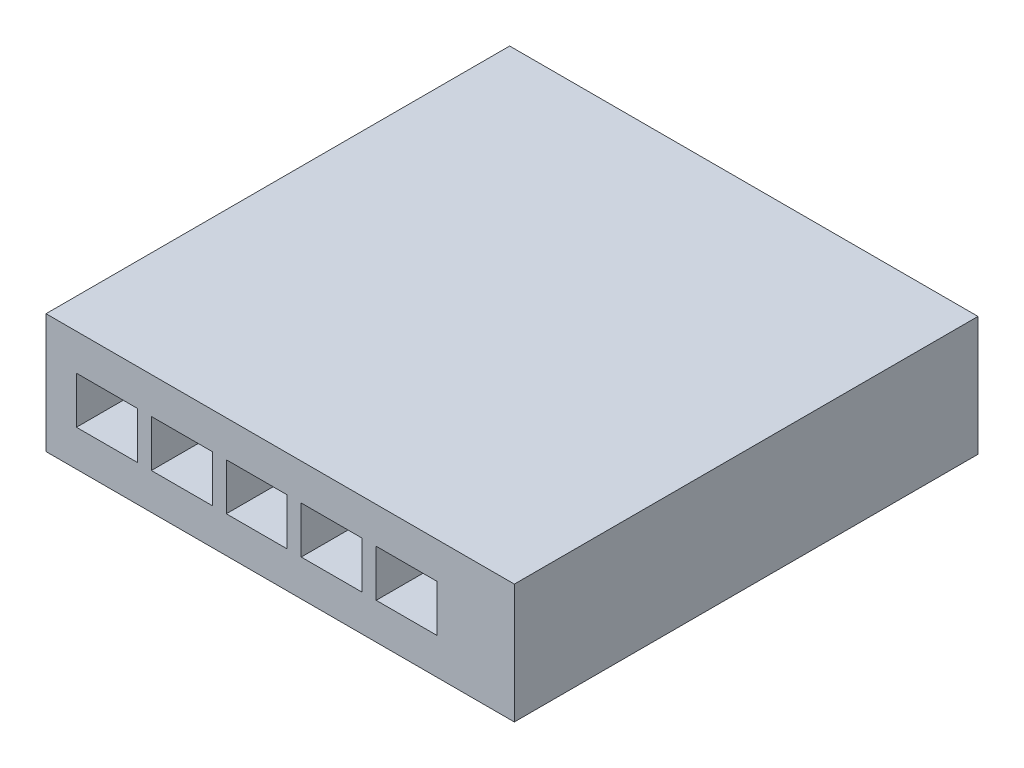
ISO-10303-21;
HEADER;
FILE_DESCRIPTION(('STEP AP214'),'2;1');
FILE_NAME('part.step','',(''),(''),'','','');
FILE_SCHEMA(('AUTOMOTIVE_DESIGN { 1 0 10303 214 1 1 1 1 }'));
ENDSEC;
DATA;
#1=APPLICATION_CONTEXT('core data for automotive mechanical design processes');
#2=APPLICATION_PROTOCOL_DEFINITION('international standard','automotive_design',2000,#1);
#3=PRODUCT_CONTEXT('',#1,'mechanical');
#4=PRODUCT('Part','Part','',(#3));
#5=PRODUCT_RELATED_PRODUCT_CATEGORY('part','',(#4));
#6=PRODUCT_DEFINITION_FORMATION('','',#4);
#7=PRODUCT_DEFINITION_CONTEXT('part definition',#1,'design');
#8=PRODUCT_DEFINITION('design','',#6,#7);
#9=PRODUCT_DEFINITION_SHAPE('','',#8);
#10=(LENGTH_UNIT() NAMED_UNIT(*) SI_UNIT(.MILLI.,.METRE.));
#11=(NAMED_UNIT(*) PLANE_ANGLE_UNIT() SI_UNIT($,.RADIAN.));
#12=(NAMED_UNIT(*) SI_UNIT($,.STERADIAN.) SOLID_ANGLE_UNIT());
#13=UNCERTAINTY_MEASURE_WITH_UNIT(LENGTH_MEASURE(1.E-05),#10,'distance_accuracy_value','');
#14=(GEOMETRIC_REPRESENTATION_CONTEXT(3) GLOBAL_UNCERTAINTY_ASSIGNED_CONTEXT((#13)) GLOBAL_UNIT_ASSIGNED_CONTEXT((#10,
#11,#12)) REPRESENTATION_CONTEXT('',''));
#15=CARTESIAN_POINT('',(0.,0.,0.));
#16=DIRECTION('',(0.,0.,1.));
#17=DIRECTION('',(1.,0.,0.));
#18=AXIS2_PLACEMENT_3D('',#15,#16,#17);
#19=CARTESIAN_POINT('',(64.,0.,29.5));
#20=DIRECTION('',(0.,0.,1.));
#21=DIRECTION('',(1.,0.,0.));
#22=AXIS2_PLACEMENT_3D('',#19,#20,#21);
#23=PLANE('',#22);
#24=DIRECTION('',(0.,1.,0.));
#25=VECTOR('',#24,1.);
#26=CARTESIAN_POINT('',(33.5,5.,29.5));
#27=LINE('',#26,#25);
#28=CARTESIAN_POINT('',(33.5,-5.,29.5));
#29=VERTEX_POINT('',#28);
#30=CARTESIAN_POINT('',(33.5,5.,29.5));
#31=VERTEX_POINT('',#30);
#32=EDGE_CURVE('E449',#29,#31,#27,.T.);
#33=ORIENTED_EDGE('',*,*,#32,.T.);
#34=DIRECTION('',(-1.,0.,0.));
#35=VECTOR('',#34,1.);
#36=CARTESIAN_POINT('',(20.5,5.,29.5));
#37=LINE('',#36,#35);
#38=CARTESIAN_POINT('',(20.5,5.,29.5));
#39=VERTEX_POINT('',#38);
#40=EDGE_CURVE('E11',#31,#39,#37,.T.);
#41=ORIENTED_EDGE('',*,*,#40,.T.);
#42=DIRECTION('',(0.,-1.,0.));
#43=VECTOR('',#42,1.);
#44=CARTESIAN_POINT('',(20.5,5.,29.5));
#45=LINE('',#44,#43);
#46=CARTESIAN_POINT('',(20.5,-5.,29.5));
#47=VERTEX_POINT('',#46);
#48=EDGE_CURVE('E53',#39,#47,#45,.T.);
#49=ORIENTED_EDGE('',*,*,#48,.T.);
#50=DIRECTION('',(1.,0.,0.));
#51=VECTOR('',#50,1.);
#52=CARTESIAN_POINT('',(20.5,-5.,29.5));
#53=LINE('',#52,#51);
#54=EDGE_CURVE('E61',#47,#29,#53,.T.);
#55=ORIENTED_EDGE('',*,*,#54,.T.);
#56=EDGE_LOOP('',(#33,#41,#49,#55));
#57=FACE_BOUND('',#56,.T.);
#58=ADVANCED_FACE('F38',(#57),#23,.T.);
#59=CARTESIAN_POINT('',(20.5,5.,29.5));
#60=DIRECTION('',(0.,1.,0.));
#61=DIRECTION('',(0.,0.,1.));
#62=AXIS2_PLACEMENT_3D('',#59,#60,#61);
#63=PLANE('',#62);
#64=DIRECTION('',(-1.,0.,0.));
#65=VECTOR('',#64,1.);
#66=CARTESIAN_POINT('',(20.5,5.,49.5));
#67=LINE('',#66,#65);
#68=CARTESIAN_POINT('',(33.5,5.,49.5));
#69=VERTEX_POINT('',#68);
#70=CARTESIAN_POINT('',(20.5,5.,49.5));
#71=VERTEX_POINT('',#70);
#72=EDGE_CURVE('E441',#69,#71,#67,.T.);
#73=ORIENTED_EDGE('',*,*,#72,.T.);
#74=DIRECTION('',(0.,0.,1.));
#75=VECTOR('',#74,1.);
#76=CARTESIAN_POINT('',(20.5,5.,29.5));
#77=LINE('',#76,#75);
#78=EDGE_CURVE('E46',#39,#71,#77,.T.);
#79=ORIENTED_EDGE('',*,*,#78,.F.);
#80=ORIENTED_EDGE('',*,*,#40,.F.);
#81=DIRECTION('',(0.,0.,1.));
#82=VECTOR('',#81,1.);
#83=CARTESIAN_POINT('',(33.5,5.,29.5));
#84=LINE('',#83,#82);
#85=EDGE_CURVE('E445',#31,#69,#84,.T.);
#86=ORIENTED_EDGE('',*,*,#85,.T.);
#87=EDGE_LOOP('',(#73,#79,#80,#86));
#88=FACE_BOUND('',#87,.T.);
#89=ADVANCED_FACE('F467',(#88),#63,.F.);
#90=CARTESIAN_POINT('',(20.5,5.,29.5));
#91=DIRECTION('',(-1.,0.,0.));
#92=DIRECTION('',(0.,0.,1.));
#93=AXIS2_PLACEMENT_3D('',#90,#91,#92);
#94=PLANE('',#93);
#95=DIRECTION('',(0.,-1.,0.));
#96=VECTOR('',#95,1.);
#97=CARTESIAN_POINT('',(20.5,5.,49.5));
#98=LINE('',#97,#96);
#99=CARTESIAN_POINT('',(20.5,-5.,49.5));
#100=VERTEX_POINT('',#99);
#101=EDGE_CURVE('E437',#71,#100,#98,.T.);
#102=ORIENTED_EDGE('',*,*,#101,.T.);
#103=DIRECTION('',(0.,0.,1.));
#104=VECTOR('',#103,1.);
#105=CARTESIAN_POINT('',(20.5,-5.,29.5));
#106=LINE('',#105,#104);
#107=EDGE_CURVE('E459',#47,#100,#106,.T.);
#108=ORIENTED_EDGE('',*,*,#107,.F.);
#109=ORIENTED_EDGE('',*,*,#48,.F.);
#110=ORIENTED_EDGE('',*,*,#78,.T.);
#111=EDGE_LOOP('',(#102,#108,#109,#110));
#112=FACE_BOUND('',#111,.T.);
#113=ADVANCED_FACE('F464',(#112),#94,.F.);
#114=CARTESIAN_POINT('',(20.5,-5.,29.5));
#115=DIRECTION('',(0.,-1.,0.));
#116=DIRECTION('',(0.,0.,-1.));
#117=AXIS2_PLACEMENT_3D('',#114,#115,#116);
#118=PLANE('',#117);
#119=DIRECTION('',(1.,0.,0.));
#120=VECTOR('',#119,1.);
#121=CARTESIAN_POINT('',(20.5,-5.,49.5));
#122=LINE('',#121,#120);
#123=CARTESIAN_POINT('',(33.5,-5.,49.5));
#124=VERTEX_POINT('',#123);
#125=EDGE_CURVE('E433',#100,#124,#122,.T.);
#126=ORIENTED_EDGE('',*,*,#125,.T.);
#127=DIRECTION('',(0.,0.,1.));
#128=VECTOR('',#127,1.);
#129=CARTESIAN_POINT('',(33.5,-5.,29.5));
#130=LINE('',#129,#128);
#131=EDGE_CURVE('E453',#29,#124,#130,.T.);
#132=ORIENTED_EDGE('',*,*,#131,.F.);
#133=ORIENTED_EDGE('',*,*,#54,.F.);
#134=ORIENTED_EDGE('',*,*,#107,.T.);
#135=EDGE_LOOP('',(#126,#132,#133,#134));
#136=FACE_BOUND('',#135,.T.);
#137=ADVANCED_FACE('F472',(#136),#118,.F.);
#138=CARTESIAN_POINT('',(33.5,5.,29.5));
#139=DIRECTION('',(1.,0.,0.));
#140=DIRECTION('',(0.,0.,-1.));
#141=AXIS2_PLACEMENT_3D('',#138,#139,#140);
#142=PLANE('',#141);
#143=DIRECTION('',(0.,1.,0.));
#144=VECTOR('',#143,1.);
#145=CARTESIAN_POINT('',(33.5,5.,49.5));
#146=LINE('',#145,#144);
#147=EDGE_CURVE('E430',#124,#69,#146,.T.);
#148=ORIENTED_EDGE('',*,*,#147,.T.);
#149=ORIENTED_EDGE('',*,*,#85,.F.);
#150=ORIENTED_EDGE('',*,*,#32,.F.);
#151=ORIENTED_EDGE('',*,*,#131,.T.);
#152=EDGE_LOOP('',(#148,#149,#150,#151));
#153=FACE_BOUND('',#152,.T.);
#154=ADVANCED_FACE('F471',(#153),#142,.F.);
#155=CARTESIAN_POINT('',(48.,0.,29.5));
#156=DIRECTION('',(0.,0.,1.));
#157=DIRECTION('',(1.,0.,0.));
#158=AXIS2_PLACEMENT_3D('',#155,#156,#157);
#159=PLANE('',#158);
#160=DIRECTION('',(0.,1.,0.));
#161=VECTOR('',#160,1.);
#162=CARTESIAN_POINT('',(17.5,5.,29.5));
#163=LINE('',#162,#161);
#164=CARTESIAN_POINT('',(17.5,-5.,29.5));
#165=VERTEX_POINT('',#164);
#166=CARTESIAN_POINT('',(17.5,5.,29.5));
#167=VERTEX_POINT('',#166);
#168=EDGE_CURVE('E402',#165,#167,#163,.T.);
#169=ORIENTED_EDGE('',*,*,#168,.T.);
#170=DIRECTION('',(-1.,0.,0.));
#171=VECTOR('',#170,1.);
#172=CARTESIAN_POINT('',(4.50000000000002,5.,29.5));
#173=LINE('',#172,#171);
#174=CARTESIAN_POINT('',(4.50000000000002,5.,29.5));
#175=VERTEX_POINT('',#174);
#176=EDGE_CURVE('E426',#167,#175,#173,.T.);
#177=ORIENTED_EDGE('',*,*,#176,.T.);
#178=DIRECTION('',(0.,-1.,0.));
#179=VECTOR('',#178,1.);
#180=CARTESIAN_POINT('',(4.50000000000002,5.,29.5));
#181=LINE('',#180,#179);
#182=CARTESIAN_POINT('',(4.50000000000002,-5.,29.5));
#183=VERTEX_POINT('',#182);
#184=EDGE_CURVE('E418',#175,#183,#181,.T.);
#185=ORIENTED_EDGE('',*,*,#184,.T.);
#186=DIRECTION('',(1.,0.,0.));
#187=VECTOR('',#186,1.);
#188=CARTESIAN_POINT('',(4.50000000000002,-5.,29.5));
#189=LINE('',#188,#187);
#190=EDGE_CURVE('E410',#183,#165,#189,.T.);
#191=ORIENTED_EDGE('',*,*,#190,.T.);
#192=EDGE_LOOP('',(#169,#177,#185,#191));
#193=FACE_BOUND('',#192,.T.);
#194=ADVANCED_FACE('F508',(#193),#159,.T.);
#195=CARTESIAN_POINT('',(4.50000000000002,5.,29.5));
#196=DIRECTION('',(0.,1.,0.));
#197=DIRECTION('',(0.,0.,1.));
#198=AXIS2_PLACEMENT_3D('',#195,#196,#197);
#199=PLANE('',#198);
#200=DIRECTION('',(-1.,0.,0.));
#201=VECTOR('',#200,1.);
#202=CARTESIAN_POINT('',(4.50000000000002,5.,49.5));
#203=LINE('',#202,#201);
#204=CARTESIAN_POINT('',(17.5,5.,49.5));
#205=VERTEX_POINT('',#204);
#206=CARTESIAN_POINT('',(4.50000000000002,5.,49.5));
#207=VERTEX_POINT('',#206);
#208=EDGE_CURVE('E394',#205,#207,#203,.T.);
#209=ORIENTED_EDGE('',*,*,#208,.T.);
#210=DIRECTION('',(0.,0.,1.));
#211=VECTOR('',#210,1.);
#212=CARTESIAN_POINT('',(4.50000000000002,5.,29.5));
#213=LINE('',#212,#211);
#214=EDGE_CURVE('E422',#175,#207,#213,.T.);
#215=ORIENTED_EDGE('',*,*,#214,.F.);
#216=ORIENTED_EDGE('',*,*,#176,.F.);
#217=DIRECTION('',(0.,0.,1.));
#218=VECTOR('',#217,1.);
#219=CARTESIAN_POINT('',(17.5,5.,29.5));
#220=LINE('',#219,#218);
#221=EDGE_CURVE('E398',#167,#205,#220,.T.);
#222=ORIENTED_EDGE('',*,*,#221,.T.);
#223=EDGE_LOOP('',(#209,#215,#216,#222));
#224=FACE_BOUND('',#223,.T.);
#225=ADVANCED_FACE('F511',(#224),#199,.F.);
#226=CARTESIAN_POINT('',(4.50000000000002,5.,29.5));
#227=DIRECTION('',(-1.,0.,0.));
#228=DIRECTION('',(0.,0.,1.));
#229=AXIS2_PLACEMENT_3D('',#226,#227,#228);
#230=PLANE('',#229);
#231=DIRECTION('',(0.,-1.,0.));
#232=VECTOR('',#231,1.);
#233=CARTESIAN_POINT('',(4.50000000000002,5.,49.5));
#234=LINE('',#233,#232);
#235=CARTESIAN_POINT('',(4.50000000000002,-5.,49.5));
#236=VERTEX_POINT('',#235);
#237=EDGE_CURVE('E390',#207,#236,#234,.T.);
#238=ORIENTED_EDGE('',*,*,#237,.T.);
#239=DIRECTION('',(0.,0.,1.));
#240=VECTOR('',#239,1.);
#241=CARTESIAN_POINT('',(4.50000000000002,-5.,29.5));
#242=LINE('',#241,#240);
#243=EDGE_CURVE('E414',#183,#236,#242,.T.);
#244=ORIENTED_EDGE('',*,*,#243,.F.);
#245=ORIENTED_EDGE('',*,*,#184,.F.);
#246=ORIENTED_EDGE('',*,*,#214,.T.);
#247=EDGE_LOOP('',(#238,#244,#245,#246));
#248=FACE_BOUND('',#247,.T.);
#249=ADVANCED_FACE('F515',(#248),#230,.F.);
#250=CARTESIAN_POINT('',(4.50000000000002,-5.,29.5));
#251=DIRECTION('',(0.,-1.,0.));
#252=DIRECTION('',(0.,0.,-1.));
#253=AXIS2_PLACEMENT_3D('',#250,#251,#252);
#254=PLANE('',#253);
#255=DIRECTION('',(1.,0.,0.));
#256=VECTOR('',#255,1.);
#257=CARTESIAN_POINT('',(4.50000000000002,-5.,49.5));
#258=LINE('',#257,#256);
#259=CARTESIAN_POINT('',(17.5,-5.,49.5));
#260=VERTEX_POINT('',#259);
#261=EDGE_CURVE('E386',#236,#260,#258,.T.);
#262=ORIENTED_EDGE('',*,*,#261,.T.);
#263=DIRECTION('',(0.,0.,1.));
#264=VECTOR('',#263,1.);
#265=CARTESIAN_POINT('',(17.5,-5.,29.5));
#266=LINE('',#265,#264);
#267=EDGE_CURVE('E406',#165,#260,#266,.T.);
#268=ORIENTED_EDGE('',*,*,#267,.F.);
#269=ORIENTED_EDGE('',*,*,#190,.F.);
#270=ORIENTED_EDGE('',*,*,#243,.T.);
#271=EDGE_LOOP('',(#262,#268,#269,#270));
#272=FACE_BOUND('',#271,.T.);
#273=ADVANCED_FACE('F519',(#272),#254,.F.);
#274=CARTESIAN_POINT('',(17.5,5.,29.5));
#275=DIRECTION('',(1.,0.,0.));
#276=DIRECTION('',(0.,0.,-1.));
#277=AXIS2_PLACEMENT_3D('',#274,#275,#276);
#278=PLANE('',#277);
#279=DIRECTION('',(0.,1.,0.));
#280=VECTOR('',#279,1.);
#281=CARTESIAN_POINT('',(17.5,5.,49.5));
#282=LINE('',#281,#280);
#283=EDGE_CURVE('E383',#260,#205,#282,.T.);
#284=ORIENTED_EDGE('',*,*,#283,.T.);
#285=ORIENTED_EDGE('',*,*,#221,.F.);
#286=ORIENTED_EDGE('',*,*,#168,.F.);
#287=ORIENTED_EDGE('',*,*,#267,.T.);
#288=EDGE_LOOP('',(#284,#285,#286,#287));
#289=FACE_BOUND('',#288,.T.);
#290=ADVANCED_FACE('F523',(#289),#278,.F.);
#291=CARTESIAN_POINT('',(32.,0.,29.5));
#292=DIRECTION('',(0.,0.,1.));
#293=DIRECTION('',(1.,0.,0.));
#294=AXIS2_PLACEMENT_3D('',#291,#292,#293);
#295=PLANE('',#294);
#296=DIRECTION('',(0.,1.,0.));
#297=VECTOR('',#296,1.);
#298=CARTESIAN_POINT('',(1.50000000000002,5.,29.5));
#299=LINE('',#298,#297);
#300=CARTESIAN_POINT('',(1.50000000000002,-5.,29.5));
#301=VERTEX_POINT('',#300);
#302=CARTESIAN_POINT('',(1.50000000000002,5.,29.5));
#303=VERTEX_POINT('',#302);
#304=EDGE_CURVE('E355',#301,#303,#299,.T.);
#305=ORIENTED_EDGE('',*,*,#304,.T.);
#306=DIRECTION('',(-1.,0.,0.));
#307=VECTOR('',#306,1.);
#308=CARTESIAN_POINT('',(-11.5,5.,29.5));
#309=LINE('',#308,#307);
#310=CARTESIAN_POINT('',(-11.5,5.,29.5));
#311=VERTEX_POINT('',#310);
#312=EDGE_CURVE('E379',#303,#311,#309,.T.);
#313=ORIENTED_EDGE('',*,*,#312,.T.);
#314=DIRECTION('',(0.,-1.,0.));
#315=VECTOR('',#314,1.);
#316=CARTESIAN_POINT('',(-11.5,5.,29.5));
#317=LINE('',#316,#315);
#318=CARTESIAN_POINT('',(-11.5,-5.,29.5));
#319=VERTEX_POINT('',#318);
#320=EDGE_CURVE('E371',#311,#319,#317,.T.);
#321=ORIENTED_EDGE('',*,*,#320,.T.);
#322=DIRECTION('',(1.,0.,0.));
#323=VECTOR('',#322,1.);
#324=CARTESIAN_POINT('',(-11.5,-5.,29.5));
#325=LINE('',#324,#323);
#326=EDGE_CURVE('E363',#319,#301,#325,.T.);
#327=ORIENTED_EDGE('',*,*,#326,.T.);
#328=EDGE_LOOP('',(#305,#313,#321,#327));
#329=FACE_BOUND('',#328,.T.);
#330=ADVANCED_FACE('F527',(#329),#295,.T.);
#331=CARTESIAN_POINT('',(-11.5,5.,29.5));
#332=DIRECTION('',(0.,1.,0.));
#333=DIRECTION('',(0.,0.,1.));
#334=AXIS2_PLACEMENT_3D('',#331,#332,#333);
#335=PLANE('',#334);
#336=DIRECTION('',(-1.,0.,0.));
#337=VECTOR('',#336,1.);
#338=CARTESIAN_POINT('',(-11.5,5.,49.5));
#339=LINE('',#338,#337);
#340=CARTESIAN_POINT('',(1.50000000000002,5.,49.5));
#341=VERTEX_POINT('',#340);
#342=CARTESIAN_POINT('',(-11.5,5.,49.5));
#343=VERTEX_POINT('',#342);
#344=EDGE_CURVE('E347',#341,#343,#339,.T.);
#345=ORIENTED_EDGE('',*,*,#344,.T.);
#346=DIRECTION('',(0.,0.,1.));
#347=VECTOR('',#346,1.);
#348=CARTESIAN_POINT('',(-11.5,5.,29.5));
#349=LINE('',#348,#347);
#350=EDGE_CURVE('E375',#311,#343,#349,.T.);
#351=ORIENTED_EDGE('',*,*,#350,.F.);
#352=ORIENTED_EDGE('',*,*,#312,.F.);
#353=DIRECTION('',(0.,0.,1.));
#354=VECTOR('',#353,1.);
#355=CARTESIAN_POINT('',(1.50000000000002,5.,29.5));
#356=LINE('',#355,#354);
#357=EDGE_CURVE('E351',#303,#341,#356,.T.);
#358=ORIENTED_EDGE('',*,*,#357,.T.);
#359=EDGE_LOOP('',(#345,#351,#352,#358));
#360=FACE_BOUND('',#359,.T.);
#361=ADVANCED_FACE('F531',(#360),#335,.F.);
#362=CARTESIAN_POINT('',(-11.5,5.,29.5));
#363=DIRECTION('',(-1.,0.,0.));
#364=DIRECTION('',(0.,0.,1.));
#365=AXIS2_PLACEMENT_3D('',#362,#363,#364);
#366=PLANE('',#365);
#367=DIRECTION('',(0.,-1.,0.));
#368=VECTOR('',#367,1.);
#369=CARTESIAN_POINT('',(-11.5,5.,49.5));
#370=LINE('',#369,#368);
#371=CARTESIAN_POINT('',(-11.5,-5.,49.5));
#372=VERTEX_POINT('',#371);
#373=EDGE_CURVE('E343',#343,#372,#370,.T.);
#374=ORIENTED_EDGE('',*,*,#373,.T.);
#375=DIRECTION('',(0.,0.,1.));
#376=VECTOR('',#375,1.);
#377=CARTESIAN_POINT('',(-11.5,-5.,29.5));
#378=LINE('',#377,#376);
#379=EDGE_CURVE('E367',#319,#372,#378,.T.);
#380=ORIENTED_EDGE('',*,*,#379,.F.);
#381=ORIENTED_EDGE('',*,*,#320,.F.);
#382=ORIENTED_EDGE('',*,*,#350,.T.);
#383=EDGE_LOOP('',(#374,#380,#381,#382));
#384=FACE_BOUND('',#383,.T.);
#385=ADVANCED_FACE('F535',(#384),#366,.F.);
#386=CARTESIAN_POINT('',(-11.5,-5.,29.5));
#387=DIRECTION('',(0.,-1.,0.));
#388=DIRECTION('',(0.,0.,-1.));
#389=AXIS2_PLACEMENT_3D('',#386,#387,#388);
#390=PLANE('',#389);
#391=DIRECTION('',(1.,0.,0.));
#392=VECTOR('',#391,1.);
#393=CARTESIAN_POINT('',(-11.5,-5.,49.5));
#394=LINE('',#393,#392);
#395=CARTESIAN_POINT('',(1.50000000000002,-5.,49.5));
#396=VERTEX_POINT('',#395);
#397=EDGE_CURVE('E339',#372,#396,#394,.T.);
#398=ORIENTED_EDGE('',*,*,#397,.T.);
#399=DIRECTION('',(0.,0.,1.));
#400=VECTOR('',#399,1.);
#401=CARTESIAN_POINT('',(1.50000000000002,-5.,29.5));
#402=LINE('',#401,#400);
#403=EDGE_CURVE('E359',#301,#396,#402,.T.);
#404=ORIENTED_EDGE('',*,*,#403,.F.);
#405=ORIENTED_EDGE('',*,*,#326,.F.);
#406=ORIENTED_EDGE('',*,*,#379,.T.);
#407=EDGE_LOOP('',(#398,#404,#405,#406));
#408=FACE_BOUND('',#407,.T.);
#409=ADVANCED_FACE('F539',(#408),#390,.F.);
#410=CARTESIAN_POINT('',(1.50000000000002,5.,29.5));
#411=DIRECTION('',(1.,0.,0.));
#412=DIRECTION('',(0.,0.,-1.));
#413=AXIS2_PLACEMENT_3D('',#410,#411,#412);
#414=PLANE('',#413);
#415=DIRECTION('',(0.,1.,0.));
#416=VECTOR('',#415,1.);
#417=CARTESIAN_POINT('',(1.50000000000002,5.,49.5));
#418=LINE('',#417,#416);
#419=EDGE_CURVE('E336',#396,#341,#418,.T.);
#420=ORIENTED_EDGE('',*,*,#419,.T.);
#421=ORIENTED_EDGE('',*,*,#357,.F.);
#422=ORIENTED_EDGE('',*,*,#304,.F.);
#423=ORIENTED_EDGE('',*,*,#403,.T.);
#424=EDGE_LOOP('',(#420,#421,#422,#423));
#425=FACE_BOUND('',#424,.T.);
#426=ADVANCED_FACE('F543',(#425),#414,.F.);
#427=CARTESIAN_POINT('',(50.,12.75,-49.5));
#428=DIRECTION('',(-1.,0.,0.));
#429=DIRECTION('',(0.,0.,1.));
#430=AXIS2_PLACEMENT_3D('',#427,#428,#429);
#431=PLANE('',#430);
#432=DIRECTION('',(0.,0.,-1.));
#433=VECTOR('',#432,1.);
#434=CARTESIAN_POINT('',(50.,-12.75,-49.5));
#435=LINE('',#434,#433);
#436=CARTESIAN_POINT('',(50.,-12.75,49.5));
#437=VERTEX_POINT('',#436);
#438=CARTESIAN_POINT('',(50.,-12.75,-49.5));
#439=VERTEX_POINT('',#438);
#440=EDGE_CURVE('E285',#437,#439,#435,.T.);
#441=ORIENTED_EDGE('',*,*,#440,.T.);
#442=DIRECTION('',(0.,-1.,0.));
#443=VECTOR('',#442,1.);
#444=CARTESIAN_POINT('',(50.,12.75,-49.5));
#445=LINE('',#444,#443);
#446=CARTESIAN_POINT('',(50.,12.75,-49.5));
#447=VERTEX_POINT('',#446);
#448=EDGE_CURVE('E332',#447,#439,#445,.T.);
#449=ORIENTED_EDGE('',*,*,#448,.F.);
#450=DIRECTION('',(0.,0.,-1.));
#451=VECTOR('',#450,1.);
#452=CARTESIAN_POINT('',(50.,12.75,-49.5));
#453=LINE('',#452,#451);
#454=CARTESIAN_POINT('',(50.,12.75,49.5));
#455=VERTEX_POINT('',#454);
#456=EDGE_CURVE('E295',#455,#447,#453,.T.);
#457=ORIENTED_EDGE('',*,*,#456,.F.);
#458=DIRECTION('',(0.,-1.,0.));
#459=VECTOR('',#458,1.);
#460=CARTESIAN_POINT('',(50.,12.75,49.5));
#461=LINE('',#460,#459);
#462=EDGE_CURVE('E309',#455,#437,#461,.T.);
#463=ORIENTED_EDGE('',*,*,#462,.T.);
#464=EDGE_LOOP('',(#441,#449,#457,#463));
#465=FACE_BOUND('',#464,.T.);
#466=ADVANCED_FACE('F547',(#465),#431,.F.);
#467=CARTESIAN_POINT('',(-50.,12.75,-49.5));
#468=DIRECTION('',(0.,0.,1.));
#469=DIRECTION('',(1.,0.,0.));
#470=AXIS2_PLACEMENT_3D('',#467,#468,#469);
#471=PLANE('',#470);
#472=CARTESIAN_POINT('',(-29.,0.,-49.5));
#473=DIRECTION('',(0.,0.,-1.));
#474=DIRECTION('',(-1.,0.,0.));
#475=AXIS2_PLACEMENT_3D('',#472,#473,#474);
#476=CIRCLE('',#475,1.5);
#477=CARTESIAN_POINT('',(-30.5,0.,-49.5));
#478=VERTEX_POINT('',#477);
#479=EDGE_CURVE('E561',#478,#478,#476,.T.);
#480=ORIENTED_EDGE('',*,*,#479,.F.);
#481=EDGE_LOOP('',(#480));
#482=FACE_BOUND('',#481,.T.);
#483=DIRECTION('',(-1.,0.,0.));
#484=VECTOR('',#483,1.);
#485=CARTESIAN_POINT('',(-50.,-12.75,-49.5));
#486=LINE('',#485,#484);
#487=CARTESIAN_POINT('',(-50.,-12.75,-49.5));
#488=VERTEX_POINT('',#487);
#489=EDGE_CURVE('E313',#439,#488,#486,.T.);
#490=ORIENTED_EDGE('',*,*,#489,.T.);
#491=DIRECTION('',(0.,-1.,0.));
#492=VECTOR('',#491,1.);
#493=CARTESIAN_POINT('',(-50.,12.75,-49.5));
#494=LINE('',#493,#492);
#495=CARTESIAN_POINT('',(-50.,12.75,-49.5));
#496=VERTEX_POINT('',#495);
#497=EDGE_CURVE('E328',#496,#488,#494,.T.);
#498=ORIENTED_EDGE('',*,*,#497,.F.);
#499=DIRECTION('',(-1.,0.,0.));
#500=VECTOR('',#499,1.);
#501=CARTESIAN_POINT('',(-50.,12.75,-49.5));
#502=LINE('',#501,#500);
#503=EDGE_CURVE('E299',#447,#496,#502,.T.);
#504=ORIENTED_EDGE('',*,*,#503,.F.);
#505=ORIENTED_EDGE('',*,*,#448,.T.);
#506=EDGE_LOOP('',(#490,#498,#504,#505));
#507=FACE_BOUND('',#506,.T.);
#508=ADVANCED_FACE('F489',(#482,#507),#471,.F.);
#509=CARTESIAN_POINT('',(-50.,12.75,-49.5));
#510=DIRECTION('',(1.,0.,0.));
#511=DIRECTION('',(0.,0.,-1.));
#512=AXIS2_PLACEMENT_3D('',#509,#510,#511);
#513=PLANE('',#512);
#514=DIRECTION('',(0.,0.,1.));
#515=VECTOR('',#514,1.);
#516=CARTESIAN_POINT('',(-50.,-12.75,-49.5));
#517=LINE('',#516,#515);
#518=CARTESIAN_POINT('',(-50.,-12.75,49.5));
#519=VERTEX_POINT('',#518);
#520=EDGE_CURVE('E316',#488,#519,#517,.T.);
#521=ORIENTED_EDGE('',*,*,#520,.T.);
#522=DIRECTION('',(0.,-1.,0.));
#523=VECTOR('',#522,1.);
#524=CARTESIAN_POINT('',(-50.,12.75,49.5));
#525=LINE('',#524,#523);
#526=CARTESIAN_POINT('',(-50.,12.75,49.5));
#527=VERTEX_POINT('',#526);
#528=EDGE_CURVE('E324',#527,#519,#525,.T.);
#529=ORIENTED_EDGE('',*,*,#528,.F.);
#530=DIRECTION('',(0.,0.,1.));
#531=VECTOR('',#530,1.);
#532=CARTESIAN_POINT('',(-50.,12.75,-49.5));
#533=LINE('',#532,#531);
#534=EDGE_CURVE('E303',#496,#527,#533,.T.);
#535=ORIENTED_EDGE('',*,*,#534,.F.);
#536=ORIENTED_EDGE('',*,*,#497,.T.);
#537=EDGE_LOOP('',(#521,#529,#535,#536));
#538=FACE_BOUND('',#537,.T.);
#539=ADVANCED_FACE('F477',(#538),#513,.F.);
#540=CARTESIAN_POINT('',(-50.,12.75,49.5));
#541=DIRECTION('',(0.,0.,-1.));
#542=DIRECTION('',(-1.,0.,0.));
#543=AXIS2_PLACEMENT_3D('',#540,#541,#542);
#544=PLANE('',#543);
#545=DIRECTION('',(-1.,0.,0.));
#546=VECTOR('',#545,1.);
#547=CARTESIAN_POINT('',(-27.5,5.,49.5));
#548=LINE('',#547,#546);
#549=CARTESIAN_POINT('',(-14.5,5.,49.5));
#550=VERTEX_POINT('',#549);
#551=CARTESIAN_POINT('',(-27.5,5.,49.5));
#552=VERTEX_POINT('',#551);
#553=EDGE_CURVE('E213',#550,#552,#548,.T.);
#554=ORIENTED_EDGE('',*,*,#553,.F.);
#555=DIRECTION('',(0.,1.,0.));
#556=VECTOR('',#555,1.);
#557=CARTESIAN_POINT('',(-14.5,5.,49.5));
#558=LINE('',#557,#556);
#559=CARTESIAN_POINT('',(-14.5,-5.,49.5));
#560=VERTEX_POINT('',#559);
#561=EDGE_CURVE('E228',#560,#550,#558,.T.);
#562=ORIENTED_EDGE('',*,*,#561,.F.);
#563=DIRECTION('',(1.,0.,0.));
#564=VECTOR('',#563,1.);
#565=CARTESIAN_POINT('',(-27.5,-5.,49.5));
#566=LINE('',#565,#564);
#567=CARTESIAN_POINT('',(-27.5,-5.,49.5));
#568=VERTEX_POINT('',#567);
#569=EDGE_CURVE('E242',#568,#560,#566,.T.);
#570=ORIENTED_EDGE('',*,*,#569,.F.);
#571=DIRECTION('',(0.,-1.,0.));
#572=VECTOR('',#571,1.);
#573=CARTESIAN_POINT('',(-27.5,5.,49.5));
#574=LINE('',#573,#572);
#575=EDGE_CURVE('E230',#552,#568,#574,.T.);
#576=ORIENTED_EDGE('',*,*,#575,.F.);
#577=EDGE_LOOP('',(#554,#562,#570,#576));
#578=FACE_BOUND('',#577,.T.);
#579=DIRECTION('',(-1.,0.,0.));
#580=VECTOR('',#579,1.);
#581=CARTESIAN_POINT('',(-43.5,5.,49.5));
#582=LINE('',#581,#580);
#583=CARTESIAN_POINT('',(-30.5,5.,49.5));
#584=VERTEX_POINT('',#583);
#585=CARTESIAN_POINT('',(-43.5,5.,49.5));
#586=VERTEX_POINT('',#585);
#587=EDGE_CURVE('E271',#584,#586,#582,.T.);
#588=ORIENTED_EDGE('',*,*,#587,.F.);
#589=DIRECTION('',(0.,1.,0.));
#590=VECTOR('',#589,1.);
#591=CARTESIAN_POINT('',(-30.5,5.,49.5));
#592=LINE('',#591,#590);
#593=CARTESIAN_POINT('',(-30.5,-5.,49.5));
#594=VERTEX_POINT('',#593);
#595=EDGE_CURVE('E250',#594,#584,#592,.T.);
#596=ORIENTED_EDGE('',*,*,#595,.F.);
#597=DIRECTION('',(1.,0.,0.));
#598=VECTOR('',#597,1.);
#599=CARTESIAN_POINT('',(-43.5,-5.,49.5));
#600=LINE('',#599,#598);
#601=CARTESIAN_POINT('',(-43.5,-5.,49.5));
#602=VERTEX_POINT('',#601);
#603=EDGE_CURVE('E256',#602,#594,#600,.T.);
#604=ORIENTED_EDGE('',*,*,#603,.F.);
#605=DIRECTION('',(0.,-1.,0.));
#606=VECTOR('',#605,1.);
#607=CARTESIAN_POINT('',(-43.5,5.,49.5));
#608=LINE('',#607,#606);
#609=EDGE_CURVE('E275',#586,#602,#608,.T.);
#610=ORIENTED_EDGE('',*,*,#609,.F.);
#611=EDGE_LOOP('',(#588,#596,#604,#610));
#612=FACE_BOUND('',#611,.T.);
#613=DIRECTION('',(1.,0.,0.));
#614=VECTOR('',#613,1.);
#615=CARTESIAN_POINT('',(-50.,-12.75,49.5));
#616=LINE('',#615,#614);
#617=EDGE_CURVE('E300',#519,#437,#616,.T.);
#618=ORIENTED_EDGE('',*,*,#617,.T.);
#619=ORIENTED_EDGE('',*,*,#462,.F.);
#620=DIRECTION('',(1.,0.,0.));
#621=VECTOR('',#620,1.);
#622=CARTESIAN_POINT('',(-50.,12.75,49.5));
#623=LINE('',#622,#621);
#624=EDGE_CURVE('E306',#527,#455,#623,.T.);
#625=ORIENTED_EDGE('',*,*,#624,.F.);
#626=ORIENTED_EDGE('',*,*,#528,.T.);
#627=EDGE_LOOP('',(#618,#619,#625,#626));
#628=FACE_BOUND('',#627,.T.);
#629=ORIENTED_EDGE('',*,*,#419,.F.);
#630=ORIENTED_EDGE('',*,*,#397,.F.);
#631=ORIENTED_EDGE('',*,*,#373,.F.);
#632=ORIENTED_EDGE('',*,*,#344,.F.);
#633=EDGE_LOOP('',(#629,#630,#631,#632));
#634=FACE_BOUND('',#633,.T.);
#635=ORIENTED_EDGE('',*,*,#283,.F.);
#636=ORIENTED_EDGE('',*,*,#261,.F.);
#637=ORIENTED_EDGE('',*,*,#237,.F.);
#638=ORIENTED_EDGE('',*,*,#208,.F.);
#639=EDGE_LOOP('',(#635,#636,#637,#638));
#640=FACE_BOUND('',#639,.T.);
#641=ORIENTED_EDGE('',*,*,#147,.F.);
#642=ORIENTED_EDGE('',*,*,#125,.F.);
#643=ORIENTED_EDGE('',*,*,#101,.F.);
#644=ORIENTED_EDGE('',*,*,#72,.F.);
#645=EDGE_LOOP('',(#641,#642,#643,#644));
#646=FACE_BOUND('',#645,.T.);
#647=ADVANCED_FACE('F474',(#578,#612,#628,#634,#640,#646),#544,.F.);
#648=CARTESIAN_POINT('',(0.,12.75,0.));
#649=DIRECTION('',(0.,1.,0.));
#650=DIRECTION('',(0.,0.,1.));
#651=AXIS2_PLACEMENT_3D('',#648,#649,#650);
#652=PLANE('',#651);
#653=ORIENTED_EDGE('',*,*,#456,.T.);
#654=ORIENTED_EDGE('',*,*,#503,.T.);
#655=ORIENTED_EDGE('',*,*,#534,.T.);
#656=ORIENTED_EDGE('',*,*,#624,.T.);
#657=EDGE_LOOP('',(#653,#654,#655,#656));
#658=FACE_BOUND('',#657,.T.);
#659=ADVANCED_FACE('F476',(#658),#652,.T.);
#660=CARTESIAN_POINT('',(0.,-12.75,0.));
#661=DIRECTION('',(0.,1.,0.));
#662=DIRECTION('',(0.,0.,1.));
#663=AXIS2_PLACEMENT_3D('',#660,#661,#662);
#664=PLANE('',#663);
#665=ORIENTED_EDGE('',*,*,#440,.F.);
#666=ORIENTED_EDGE('',*,*,#617,.F.);
#667=ORIENTED_EDGE('',*,*,#520,.F.);
#668=ORIENTED_EDGE('',*,*,#489,.F.);
#669=EDGE_LOOP('',(#665,#666,#667,#668));
#670=FACE_BOUND('',#669,.T.);
#671=ADVANCED_FACE('F485',(#670),#664,.F.);
#672=CARTESIAN_POINT('',(-30.5,5.,29.5));
#673=DIRECTION('',(1.,0.,0.));
#674=DIRECTION('',(0.,0.,-1.));
#675=AXIS2_PLACEMENT_3D('',#672,#673,#674);
#676=PLANE('',#675);
#677=ORIENTED_EDGE('',*,*,#595,.T.);
#678=DIRECTION('',(0.,0.,1.));
#679=VECTOR('',#678,1.);
#680=CARTESIAN_POINT('',(-30.5,5.,29.5));
#681=LINE('',#680,#679);
#682=CARTESIAN_POINT('',(-30.5,5.,29.5));
#683=VERTEX_POINT('',#682);
#684=EDGE_CURVE('E268',#683,#584,#681,.T.);
#685=ORIENTED_EDGE('',*,*,#684,.F.);
#686=DIRECTION('',(0.,1.,0.));
#687=VECTOR('',#686,1.);
#688=CARTESIAN_POINT('',(-30.5,5.,29.5));
#689=LINE('',#688,#687);
#690=CARTESIAN_POINT('',(-30.5,-5.,29.5));
#691=VERTEX_POINT('',#690);
#692=EDGE_CURVE('E251',#691,#683,#689,.T.);
#693=ORIENTED_EDGE('',*,*,#692,.F.);
#694=DIRECTION('',(0.,0.,1.));
#695=VECTOR('',#694,1.);
#696=CARTESIAN_POINT('',(-30.5,-5.,29.5));
#697=LINE('',#696,#695);
#698=EDGE_CURVE('E282',#691,#594,#697,.T.);
#699=ORIENTED_EDGE('',*,*,#698,.T.);
#700=EDGE_LOOP('',(#677,#685,#693,#699));
#701=FACE_BOUND('',#700,.T.);
#702=ADVANCED_FACE('F586',(#701),#676,.F.);
#703=CARTESIAN_POINT('',(-43.5,-5.,29.5));
#704=DIRECTION('',(0.,-1.,0.));
#705=DIRECTION('',(0.,0.,-1.));
#706=AXIS2_PLACEMENT_3D('',#703,#704,#705);
#707=PLANE('',#706);
#708=ORIENTED_EDGE('',*,*,#603,.T.);
#709=ORIENTED_EDGE('',*,*,#698,.F.);
#710=DIRECTION('',(1.,0.,0.));
#711=VECTOR('',#710,1.);
#712=CARTESIAN_POINT('',(-43.5,-5.,29.5));
#713=LINE('',#712,#711);
#714=CARTESIAN_POINT('',(-43.5,-5.,29.5));
#715=VERTEX_POINT('',#714);
#716=EDGE_CURVE('E264',#715,#691,#713,.T.);
#717=ORIENTED_EDGE('',*,*,#716,.F.);
#718=DIRECTION('',(0.,0.,1.));
#719=VECTOR('',#718,1.);
#720=CARTESIAN_POINT('',(-43.5,-5.,29.5));
#721=LINE('',#720,#719);
#722=EDGE_CURVE('E286',#715,#602,#721,.T.);
#723=ORIENTED_EDGE('',*,*,#722,.T.);
#724=EDGE_LOOP('',(#708,#709,#717,#723));
#725=FACE_BOUND('',#724,.T.);
#726=ADVANCED_FACE('F590',(#725),#707,.F.);
#727=CARTESIAN_POINT('',(-43.5,5.,29.5));
#728=DIRECTION('',(-1.,0.,0.));
#729=DIRECTION('',(0.,0.,1.));
#730=AXIS2_PLACEMENT_3D('',#727,#728,#729);
#731=PLANE('',#730);
#732=ORIENTED_EDGE('',*,*,#609,.T.);
#733=ORIENTED_EDGE('',*,*,#722,.F.);
#734=DIRECTION('',(0.,-1.,0.));
#735=VECTOR('',#734,1.);
#736=CARTESIAN_POINT('',(-43.5,5.,29.5));
#737=LINE('',#736,#735);
#738=CARTESIAN_POINT('',(-43.5,5.,29.5));
#739=VERTEX_POINT('',#738);
#740=EDGE_CURVE('E260',#739,#715,#737,.T.);
#741=ORIENTED_EDGE('',*,*,#740,.F.);
#742=DIRECTION('',(0.,0.,1.));
#743=VECTOR('',#742,1.);
#744=CARTESIAN_POINT('',(-43.5,5.,29.5));
#745=LINE('',#744,#743);
#746=EDGE_CURVE('E289',#739,#586,#745,.T.);
#747=ORIENTED_EDGE('',*,*,#746,.T.);
#748=EDGE_LOOP('',(#732,#733,#741,#747));
#749=FACE_BOUND('',#748,.T.);
#750=ADVANCED_FACE('F598',(#749),#731,.F.);
#751=CARTESIAN_POINT('',(-43.5,5.,29.5));
#752=DIRECTION('',(0.,1.,0.));
#753=DIRECTION('',(0.,0.,1.));
#754=AXIS2_PLACEMENT_3D('',#751,#752,#753);
#755=PLANE('',#754);
#756=ORIENTED_EDGE('',*,*,#587,.T.);
#757=ORIENTED_EDGE('',*,*,#746,.F.);
#758=DIRECTION('',(-1.,0.,0.));
#759=VECTOR('',#758,1.);
#760=CARTESIAN_POINT('',(-43.5,5.,29.5));
#761=LINE('',#760,#759);
#762=EDGE_CURVE('E255',#683,#739,#761,.T.);
#763=ORIENTED_EDGE('',*,*,#762,.F.);
#764=ORIENTED_EDGE('',*,*,#684,.T.);
#765=EDGE_LOOP('',(#756,#757,#763,#764));
#766=FACE_BOUND('',#765,.T.);
#767=ADVANCED_FACE('F594',(#766),#755,.F.);
#768=CARTESIAN_POINT('',(0.,0.,29.5));
#769=DIRECTION('',(0.,0.,1.));
#770=DIRECTION('',(1.,0.,0.));
#771=AXIS2_PLACEMENT_3D('',#768,#769,#770);
#772=PLANE('',#771);
#773=ORIENTED_EDGE('',*,*,#692,.T.);
#774=ORIENTED_EDGE('',*,*,#762,.T.);
#775=ORIENTED_EDGE('',*,*,#740,.T.);
#776=ORIENTED_EDGE('',*,*,#716,.T.);
#777=EDGE_LOOP('',(#773,#774,#775,#776));
#778=FACE_BOUND('',#777,.T.);
#779=ADVANCED_FACE('F597',(#778),#772,.T.);
#780=CARTESIAN_POINT('',(-14.5,5.,29.5));
#781=DIRECTION('',(1.,0.,0.));
#782=DIRECTION('',(0.,0.,-1.));
#783=AXIS2_PLACEMENT_3D('',#780,#781,#782);
#784=PLANE('',#783);
#785=ORIENTED_EDGE('',*,*,#561,.T.);
#786=DIRECTION('',(0.,0.,1.));
#787=VECTOR('',#786,1.);
#788=CARTESIAN_POINT('',(-14.5,5.,29.5));
#789=LINE('',#788,#787);
#790=CARTESIAN_POINT('',(-14.5,5.,29.5));
#791=VERTEX_POINT('',#790);
#792=EDGE_CURVE('E219',#791,#550,#789,.T.);
#793=ORIENTED_EDGE('',*,*,#792,.F.);
#794=DIRECTION('',(0.,1.,0.));
#795=VECTOR('',#794,1.);
#796=CARTESIAN_POINT('',(-14.5,5.,29.5));
#797=LINE('',#796,#795);
#798=CARTESIAN_POINT('',(-14.5,-5.,29.5));
#799=VERTEX_POINT('',#798);
#800=EDGE_CURVE('E201',#799,#791,#797,.T.);
#801=ORIENTED_EDGE('',*,*,#800,.F.);
#802=DIRECTION('',(0.,0.,1.));
#803=VECTOR('',#802,1.);
#804=CARTESIAN_POINT('',(-14.5,-5.,29.5));
#805=LINE('',#804,#803);
#806=EDGE_CURVE('E245',#799,#560,#805,.T.);
#807=ORIENTED_EDGE('',*,*,#806,.T.);
#808=EDGE_LOOP('',(#785,#793,#801,#807));
#809=FACE_BOUND('',#808,.T.);
#810=ADVANCED_FACE('F226',(#809),#784,.F.);
#811=CARTESIAN_POINT('',(-27.5,-5.,29.5));
#812=DIRECTION('',(0.,-1.,0.));
#813=DIRECTION('',(0.,0.,-1.));
#814=AXIS2_PLACEMENT_3D('',#811,#812,#813);
#815=PLANE('',#814);
#816=ORIENTED_EDGE('',*,*,#569,.T.);
#817=ORIENTED_EDGE('',*,*,#806,.F.);
#818=DIRECTION('',(1.,0.,0.));
#819=VECTOR('',#818,1.);
#820=CARTESIAN_POINT('',(-27.5,-5.,29.5));
#821=LINE('',#820,#819);
#822=CARTESIAN_POINT('',(-27.5,-5.,29.5));
#823=VERTEX_POINT('',#822);
#824=EDGE_CURVE('E207',#823,#799,#821,.T.);
#825=ORIENTED_EDGE('',*,*,#824,.F.);
#826=DIRECTION('',(0.,0.,1.));
#827=VECTOR('',#826,1.);
#828=CARTESIAN_POINT('',(-27.5,-5.,29.5));
#829=LINE('',#828,#827);
#830=EDGE_CURVE('E234',#823,#568,#829,.T.);
#831=ORIENTED_EDGE('',*,*,#830,.T.);
#832=EDGE_LOOP('',(#816,#817,#825,#831));
#833=FACE_BOUND('',#832,.T.);
#834=ADVANCED_FACE('F611',(#833),#815,.F.);
#835=CARTESIAN_POINT('',(-27.5,5.,29.5));
#836=DIRECTION('',(-1.,0.,0.));
#837=DIRECTION('',(0.,0.,1.));
#838=AXIS2_PLACEMENT_3D('',#835,#836,#837);
#839=PLANE('',#838);
#840=ORIENTED_EDGE('',*,*,#575,.T.);
#841=ORIENTED_EDGE('',*,*,#830,.F.);
#842=DIRECTION('',(0.,-1.,0.));
#843=VECTOR('',#842,1.);
#844=CARTESIAN_POINT('',(-27.5,5.,29.5));
#845=LINE('',#844,#843);
#846=CARTESIAN_POINT('',(-27.5,5.,29.5));
#847=VERTEX_POINT('',#846);
#848=EDGE_CURVE('E224',#847,#823,#845,.T.);
#849=ORIENTED_EDGE('',*,*,#848,.F.);
#850=DIRECTION('',(0.,0.,1.));
#851=VECTOR('',#850,1.);
#852=CARTESIAN_POINT('',(-27.5,5.,29.5));
#853=LINE('',#852,#851);
#854=EDGE_CURVE('E222',#847,#552,#853,.T.);
#855=ORIENTED_EDGE('',*,*,#854,.T.);
#856=EDGE_LOOP('',(#840,#841,#849,#855));
#857=FACE_BOUND('',#856,.T.);
#858=ADVANCED_FACE('F614',(#857),#839,.F.);
#859=CARTESIAN_POINT('',(-27.5,5.,29.5));
#860=DIRECTION('',(0.,1.,0.));
#861=DIRECTION('',(0.,0.,1.));
#862=AXIS2_PLACEMENT_3D('',#859,#860,#861);
#863=PLANE('',#862);
#864=ORIENTED_EDGE('',*,*,#553,.T.);
#865=ORIENTED_EDGE('',*,*,#854,.F.);
#866=DIRECTION('',(-1.,0.,0.));
#867=VECTOR('',#866,1.);
#868=CARTESIAN_POINT('',(-27.5,5.,29.5));
#869=LINE('',#868,#867);
#870=EDGE_CURVE('E204',#791,#847,#869,.T.);
#871=ORIENTED_EDGE('',*,*,#870,.F.);
#872=ORIENTED_EDGE('',*,*,#792,.T.);
#873=EDGE_LOOP('',(#864,#865,#871,#872));
#874=FACE_BOUND('',#873,.T.);
#875=ADVANCED_FACE('F218',(#874),#863,.F.);
#876=CARTESIAN_POINT('',(16.,0.,29.5));
#877=DIRECTION('',(0.,0.,1.));
#878=DIRECTION('',(1.,0.,0.));
#879=AXIS2_PLACEMENT_3D('',#876,#877,#878);
#880=PLANE('',#879);
#881=ORIENTED_EDGE('',*,*,#800,.T.);
#882=ORIENTED_EDGE('',*,*,#870,.T.);
#883=ORIENTED_EDGE('',*,*,#848,.T.);
#884=ORIENTED_EDGE('',*,*,#824,.T.);
#885=EDGE_LOOP('',(#881,#882,#883,#884));
#886=FACE_BOUND('',#885,.T.);
#887=ADVANCED_FACE('F203',(#886),#880,.T.);
#888=CARTESIAN_POINT('',(-29.,0.,-39.5));
#889=DIRECTION('',(0.,0.,-1.));
#890=DIRECTION('',(-1.,0.,0.));
#891=AXIS2_PLACEMENT_3D('',#888,#889,#890);
#892=CYLINDRICAL_SURFACE('',#891,1.5);
#893=CARTESIAN_POINT('',(-29.,0.,-39.5));
#894=DIRECTION('',(0.,0.,-1.));
#895=DIRECTION('',(-1.,0.,0.));
#896=AXIS2_PLACEMENT_3D('',#893,#894,#895);
#897=CIRCLE('',#896,1.5);
#898=CARTESIAN_POINT('',(-30.5,0.,-39.5));
#899=VERTEX_POINT('',#898);
#900=EDGE_CURVE('E634',#899,#899,#897,.T.);
#901=ORIENTED_EDGE('',*,*,#900,.F.);
#902=EDGE_LOOP('',(#901));
#903=FACE_BOUND('',#902,.T.);
#904=ORIENTED_EDGE('',*,*,#479,.T.);
#905=EDGE_LOOP('',(#904));
#906=FACE_BOUND('',#905,.T.);
#907=ADVANCED_FACE('F623',(#903,#906),#892,.F.);
#908=CARTESIAN_POINT('',(-29.,0.,-39.5));
#909=DIRECTION('',(0.,0.,-1.));
#910=DIRECTION('',(-1.,0.,0.));
#911=AXIS2_PLACEMENT_3D('',#908,#909,#910);
#912=PLANE('',#911);
#913=ORIENTED_EDGE('',*,*,#900,.T.);
#914=EDGE_LOOP('',(#913));
#915=FACE_BOUND('',#914,.T.);
#916=ADVANCED_FACE('F626',(#915),#912,.T.);
#917=CLOSED_SHELL('',(#58,#89,#113,#137,#154,#194,#225,#249,#273,#290,#330,#361,#385,#409,#426,
#466,#508,#539,#647,#659,#671,#702,#726,#750,#767,#779,#810,#834,#858,#875,#887,#907,#916));
#918=MANIFOLD_SOLID_BREP('B2',#917);
#919=ADVANCED_BREP_SHAPE_REPRESENTATION('',(#18,#918),#14);
#920=SHAPE_DEFINITION_REPRESENTATION(#9,#919);
ENDSEC;
END-ISO-10303-21;
